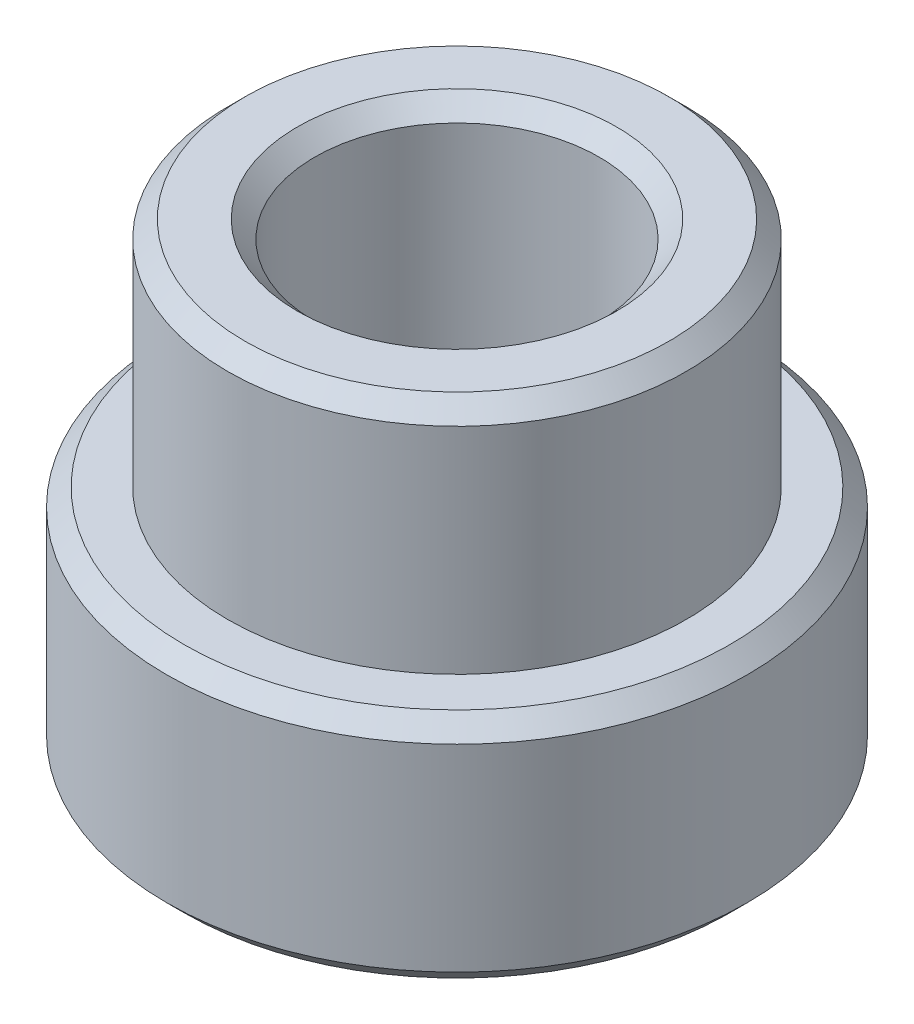
ISO-10303-21;
HEADER;
FILE_DESCRIPTION(('STEP AP214'),'2;1');
FILE_NAME('part.step','',(''),(''),'','','');
FILE_SCHEMA(('AUTOMOTIVE_DESIGN { 1 0 10303 214 1 1 1 1 }'));
ENDSEC;
DATA;
#1=APPLICATION_CONTEXT('core data for automotive mechanical design processes');
#2=APPLICATION_PROTOCOL_DEFINITION('international standard','automotive_design',2000,#1);
#3=PRODUCT_CONTEXT('',#1,'mechanical');
#4=PRODUCT('Part','Part','',(#3));
#5=PRODUCT_RELATED_PRODUCT_CATEGORY('part','',(#4));
#6=PRODUCT_DEFINITION_FORMATION('','',#4);
#7=PRODUCT_DEFINITION_CONTEXT('part definition',#1,'design');
#8=PRODUCT_DEFINITION('design','',#6,#7);
#9=PRODUCT_DEFINITION_SHAPE('','',#8);
#10=(LENGTH_UNIT() NAMED_UNIT(*) SI_UNIT(.MILLI.,.METRE.));
#11=(NAMED_UNIT(*) PLANE_ANGLE_UNIT() SI_UNIT($,.RADIAN.));
#12=(NAMED_UNIT(*) SI_UNIT($,.STERADIAN.) SOLID_ANGLE_UNIT());
#13=UNCERTAINTY_MEASURE_WITH_UNIT(LENGTH_MEASURE(1.E-05),#10,'distance_accuracy_value','');
#14=(GEOMETRIC_REPRESENTATION_CONTEXT(3) GLOBAL_UNCERTAINTY_ASSIGNED_CONTEXT((#13)) GLOBAL_UNIT_ASSIGNED_CONTEXT((#10,
#11,#12)) REPRESENTATION_CONTEXT('',''));
#15=CARTESIAN_POINT('',(0.,0.,0.));
#16=DIRECTION('',(0.,0.,1.));
#17=DIRECTION('',(1.,0.,0.));
#18=AXIS2_PLACEMENT_3D('',#15,#16,#17);
#19=CARTESIAN_POINT('',(0.,8.,0.));
#20=DIRECTION('',(0.,1.,0.));
#21=DIRECTION('',(0.,0.,1.));
#22=AXIS2_PLACEMENT_3D('',#19,#20,#21);
#23=PLANE('',#22);
#24=CARTESIAN_POINT('',(0.,8.,0.));
#25=DIRECTION('',(0.,1.,0.));
#26=DIRECTION('',(0.,0.,1.));
#27=AXIS2_PLACEMENT_3D('',#24,#25,#26);
#28=CIRCLE('',#27,2.75);
#29=CARTESIAN_POINT('',(0.,8.,2.75));
#30=VERTEX_POINT('',#29);
#31=EDGE_CURVE('E41',#30,#30,#28,.F.);
#32=ORIENTED_EDGE('',*,*,#31,.T.);
#33=EDGE_LOOP('',(#32));
#34=FACE_BOUND('',#33,.T.);
#35=CARTESIAN_POINT('',(0.,8.,0.));
#36=DIRECTION('',(0.,1.,0.));
#37=DIRECTION('',(0.,0.,1.));
#38=AXIS2_PLACEMENT_3D('',#35,#36,#37);
#39=CIRCLE('',#38,3.65);
#40=CARTESIAN_POINT('',(0.,8.,3.65));
#41=VERTEX_POINT('',#40);
#42=EDGE_CURVE('E45',#41,#41,#39,.T.);
#43=ORIENTED_EDGE('',*,*,#42,.T.);
#44=EDGE_LOOP('',(#43));
#45=FACE_BOUND('',#44,.T.);
#46=ADVANCED_FACE('F34',(#34,#45),#23,.T.);
#47=CARTESIAN_POINT('',(0.,8.,0.));
#48=DIRECTION('',(0.,-1.,0.));
#49=DIRECTION('',(0.,0.,-1.));
#50=AXIS2_PLACEMENT_3D('',#47,#48,#49);
#51=CYLINDRICAL_SURFACE('',#50,5.);
#52=CARTESIAN_POINT('',(0.,0.300000000000002,0.));
#53=DIRECTION('',(0.,1.,0.));
#54=DIRECTION('',(0.,0.,1.));
#55=AXIS2_PLACEMENT_3D('',#52,#53,#54);
#56=CIRCLE('',#55,5.);
#57=CARTESIAN_POINT('',(0.,0.300000000000002,5.));
#58=VERTEX_POINT('',#57);
#59=EDGE_CURVE('E54',#58,#58,#56,.T.);
#60=ORIENTED_EDGE('',*,*,#59,.T.);
#61=EDGE_LOOP('',(#60));
#62=FACE_BOUND('',#61,.T.);
#63=CARTESIAN_POINT('',(0.,3.7,0.));
#64=DIRECTION('',(0.,1.,0.));
#65=DIRECTION('',(0.,0.,1.));
#66=AXIS2_PLACEMENT_3D('',#63,#64,#65);
#67=CIRCLE('',#66,5.);
#68=CARTESIAN_POINT('',(0.,3.7,5.));
#69=VERTEX_POINT('',#68);
#70=EDGE_CURVE('E57',#69,#69,#67,.F.);
#71=ORIENTED_EDGE('',*,*,#70,.T.);
#72=EDGE_LOOP('',(#71));
#73=FACE_BOUND('',#72,.T.);
#74=ADVANCED_FACE('F94',(#62,#73),#51,.T.);
#75=CARTESIAN_POINT('',(0.,0.,0.));
#76=DIRECTION('',(0.,1.,0.));
#77=DIRECTION('',(0.,0.,1.));
#78=AXIS2_PLACEMENT_3D('',#75,#76,#77);
#79=PLANE('',#78);
#80=CARTESIAN_POINT('',(0.,0.,0.));
#81=DIRECTION('',(0.,1.,0.));
#82=DIRECTION('',(0.,0.,1.));
#83=AXIS2_PLACEMENT_3D('',#80,#81,#82);
#84=CIRCLE('',#83,2.75);
#85=CARTESIAN_POINT('',(0.,0.,2.75));
#86=VERTEX_POINT('',#85);
#87=EDGE_CURVE('E66',#86,#86,#84,.T.);
#88=ORIENTED_EDGE('',*,*,#87,.T.);
#89=EDGE_LOOP('',(#88));
#90=FACE_BOUND('',#89,.T.);
#91=CARTESIAN_POINT('',(0.,0.,0.));
#92=DIRECTION('',(0.,1.,0.));
#93=DIRECTION('',(0.,0.,1.));
#94=AXIS2_PLACEMENT_3D('',#91,#92,#93);
#95=CIRCLE('',#94,4.7);
#96=CARTESIAN_POINT('',(0.,0.,4.7));
#97=VERTEX_POINT('',#96);
#98=EDGE_CURVE('E69',#97,#97,#95,.F.);
#99=ORIENTED_EDGE('',*,*,#98,.T.);
#100=EDGE_LOOP('',(#99));
#101=FACE_BOUND('',#100,.T.);
#102=ADVANCED_FACE('F99',(#90,#101),#79,.F.);
#103=CARTESIAN_POINT('',(0.,8.,0.));
#104=DIRECTION('',(0.,-1.,0.));
#105=DIRECTION('',(0.,0.,-1.));
#106=AXIS2_PLACEMENT_3D('',#103,#104,#105);
#107=CYLINDRICAL_SURFACE('',#106,2.45);
#108=CARTESIAN_POINT('',(0.,0.3,0.));
#109=DIRECTION('',(0.,1.,0.));
#110=DIRECTION('',(0.,0.,1.));
#111=AXIS2_PLACEMENT_3D('',#108,#109,#110);
#112=CIRCLE('',#111,2.45);
#113=CARTESIAN_POINT('',(0.,0.3,2.45));
#114=VERTEX_POINT('',#113);
#115=EDGE_CURVE('E60',#114,#114,#112,.F.);
#116=ORIENTED_EDGE('',*,*,#115,.T.);
#117=EDGE_LOOP('',(#116));
#118=FACE_BOUND('',#117,.T.);
#119=CARTESIAN_POINT('',(0.,7.7,0.));
#120=DIRECTION('',(0.,1.,0.));
#121=DIRECTION('',(0.,0.,1.));
#122=AXIS2_PLACEMENT_3D('',#119,#120,#121);
#123=CIRCLE('',#122,2.45);
#124=CARTESIAN_POINT('',(0.,7.7,2.45));
#125=VERTEX_POINT('',#124);
#126=EDGE_CURVE('E63',#125,#125,#123,.T.);
#127=ORIENTED_EDGE('',*,*,#126,.T.);
#128=EDGE_LOOP('',(#127));
#129=FACE_BOUND('',#128,.T.);
#130=ADVANCED_FACE('F89',(#118,#129),#107,.F.);
#131=CARTESIAN_POINT('',(0.,4.,0.));
#132=DIRECTION('',(0.,1.,0.));
#133=DIRECTION('',(0.,0.,1.));
#134=AXIS2_PLACEMENT_3D('',#131,#132,#133);
#135=PLANE('',#134);
#136=CARTESIAN_POINT('',(0.,4.,0.));
#137=DIRECTION('',(0.,1.,0.));
#138=DIRECTION('',(0.,0.,1.));
#139=AXIS2_PLACEMENT_3D('',#136,#137,#138);
#140=CIRCLE('',#139,4.7);
#141=CARTESIAN_POINT('',(0.,4.,4.7));
#142=VERTEX_POINT('',#141);
#143=EDGE_CURVE('E49',#142,#142,#140,.T.);
#144=ORIENTED_EDGE('',*,*,#143,.T.);
#145=EDGE_LOOP('',(#144));
#146=FACE_BOUND('',#145,.T.);
#147=CARTESIAN_POINT('',(0.,4.,0.));
#148=DIRECTION('',(0.,1.,0.));
#149=DIRECTION('',(0.,0.,1.));
#150=AXIS2_PLACEMENT_3D('',#147,#148,#149);
#151=CIRCLE('',#150,3.95);
#152=CARTESIAN_POINT('',(0.,3.99999999999999,3.95));
#153=VERTEX_POINT('',#152);
#154=EDGE_CURVE('E72',#153,#153,#151,.F.);
#155=ORIENTED_EDGE('',*,*,#154,.T.);
#156=EDGE_LOOP('',(#155));
#157=FACE_BOUND('',#156,.T.);
#158=ADVANCED_FACE('F76',(#146,#157),#135,.T.);
#159=CARTESIAN_POINT('',(0.,-28.2842712474619,0.));
#160=DIRECTION('',(0.,1.,0.));
#161=DIRECTION('',(0.,0.,1.));
#162=AXIS2_PLACEMENT_3D('',#159,#160,#161);
#163=CYLINDRICAL_SURFACE('',#162,3.95);
#164=CARTESIAN_POINT('',(0.,7.7,0.));
#165=DIRECTION('',(0.,1.,0.));
#166=DIRECTION('',(0.,0.,1.));
#167=AXIS2_PLACEMENT_3D('',#164,#165,#166);
#168=CIRCLE('',#167,3.95);
#169=CARTESIAN_POINT('',(0.,7.7,3.95));
#170=VERTEX_POINT('',#169);
#171=EDGE_CURVE('E11',#170,#170,#168,.F.);
#172=CARTESIAN_POINT('',(0.,7.7,3.95));
#173=CARTESIAN_POINT('',(0.,7.66145833333333,3.95));
#174=CARTESIAN_POINT('',(0.,7.62291666666666,3.95));
#175=CARTESIAN_POINT('',(0.,7.54583333333333,3.95));
#176=CARTESIAN_POINT('',(0.,7.50729166666666,3.95));
#177=CARTESIAN_POINT('',(0.,7.43020833333333,3.95));
#178=CARTESIAN_POINT('',(0.,7.39166666666666,3.95));
#179=CARTESIAN_POINT('',(0.,7.31458333333333,3.95));
#180=CARTESIAN_POINT('',(0.,7.27604166666666,3.95));
#181=CARTESIAN_POINT('',(0.,7.19895833333333,3.95));
#182=CARTESIAN_POINT('',(0.,7.16041666666666,3.95));
#183=CARTESIAN_POINT('',(0.,7.08333333333333,3.95));
#184=CARTESIAN_POINT('',(0.,7.04479166666667,3.95));
#185=CARTESIAN_POINT('',(0.,6.96770833333333,3.95));
#186=CARTESIAN_POINT('',(0.,6.92916666666666,3.95));
#187=CARTESIAN_POINT('',(0.,6.85208333333333,3.95));
#188=CARTESIAN_POINT('',(0.,6.81354166666666,3.95));
#189=CARTESIAN_POINT('',(0.,6.73645833333333,3.95));
#190=CARTESIAN_POINT('',(0.,6.69791666666666,3.95));
#191=CARTESIAN_POINT('',(0.,6.62083333333333,3.95));
#192=CARTESIAN_POINT('',(0.,6.58229166666666,3.95));
#193=CARTESIAN_POINT('',(0.,6.50520833333333,3.95));
#194=CARTESIAN_POINT('',(0.,6.46666666666666,3.95));
#195=CARTESIAN_POINT('',(0.,6.38958333333333,3.95));
#196=CARTESIAN_POINT('',(0.,6.35104166666666,3.95));
#197=CARTESIAN_POINT('',(0.,6.27395833333333,3.95));
#198=CARTESIAN_POINT('',(0.,6.23541666666666,3.95));
#199=CARTESIAN_POINT('',(0.,6.15833333333333,3.95));
#200=CARTESIAN_POINT('',(0.,6.11979166666666,3.95));
#201=CARTESIAN_POINT('',(0.,6.04270833333333,3.95));
#202=CARTESIAN_POINT('',(0.,6.00416666666666,3.95));
#203=CARTESIAN_POINT('',(0.,5.92708333333333,3.95));
#204=CARTESIAN_POINT('',(0.,5.88854166666666,3.95));
#205=CARTESIAN_POINT('',(0.,5.81145833333333,3.95));
#206=CARTESIAN_POINT('',(0.,5.77291666666666,3.95));
#207=CARTESIAN_POINT('',(0.,5.69583333333333,3.95));
#208=CARTESIAN_POINT('',(0.,5.65729166666666,3.95));
#209=CARTESIAN_POINT('',(0.,5.58020833333333,3.95));
#210=CARTESIAN_POINT('',(0.,5.54166666666666,3.95));
#211=CARTESIAN_POINT('',(0.,5.46458333333332,3.95));
#212=CARTESIAN_POINT('',(0.,5.42604166666666,3.95));
#213=CARTESIAN_POINT('',(0.,5.34895833333332,3.95));
#214=CARTESIAN_POINT('',(0.,5.31041666666666,3.95));
#215=CARTESIAN_POINT('',(0.,5.23333333333333,3.95));
#216=CARTESIAN_POINT('',(0.,5.19479166666666,3.95));
#217=CARTESIAN_POINT('',(0.,5.11770833333333,3.95));
#218=CARTESIAN_POINT('',(0.,5.07916666666666,3.95));
#219=CARTESIAN_POINT('',(0.,5.00208333333333,3.95));
#220=CARTESIAN_POINT('',(0.,4.96354166666666,3.95));
#221=CARTESIAN_POINT('',(0.,4.88645833333332,3.95));
#222=CARTESIAN_POINT('',(0.,4.84791666666666,3.95));
#223=CARTESIAN_POINT('',(0.,4.77083333333332,3.95));
#224=CARTESIAN_POINT('',(0.,4.73229166666666,3.95));
#225=CARTESIAN_POINT('',(0.,4.65520833333332,3.95));
#226=CARTESIAN_POINT('',(0.,4.61666666666666,3.95));
#227=CARTESIAN_POINT('',(0.,4.53958333333332,3.95));
#228=CARTESIAN_POINT('',(0.,4.50104166666666,3.95));
#229=CARTESIAN_POINT('',(0.,4.42395833333333,3.95));
#230=CARTESIAN_POINT('',(0.,4.38541666666666,3.95));
#231=CARTESIAN_POINT('',(0.,4.30833333333333,3.95));
#232=CARTESIAN_POINT('',(0.,4.26979166666666,3.95));
#233=CARTESIAN_POINT('',(0.,4.19270833333333,3.95));
#234=CARTESIAN_POINT('',(0.,4.15416666666666,3.95));
#235=CARTESIAN_POINT('',(0.,4.07708333333332,3.95));
#236=CARTESIAN_POINT('',(0.,4.03854166666666,3.95));
#237=CARTESIAN_POINT('',(0.,3.99999999999999,3.95));
#238=B_SPLINE_CURVE_WITH_KNOTS('',3,(#172,#173,#174,#175,#176,#177,#178,#179,#180,#181,#182,
#183,#184,#185,#186,#187,#188,#189,#190,#191,#192,#193,#194,#195,#196,#197,#198,#199,#200,#201,
#202,#203,#204,#205,#206,#207,#208,#209,#210,#211,#212,#213,#214,#215,#216,#217,#218,#219,#220,
#221,#222,#223,#224,#225,#226,#227,#228,#229,#230,#231,#232,#233,#234,#235,#236,#237),
.UNSPECIFIED.,.F.,.F.,(4,2,2,2,2,2,2,2,2,2,2,2,2,2,2,2,2,2,2,2,2,2,2,2,2,2,2,2,2,2,2,2,4),(0.,
0.115625000000001,0.231250000000002,0.346875000000003,0.462500000000005,0.578124999999999,
0.69375,0.809375000000001,0.925000000000002,1.040625,1.15625,1.27187500000001,1.3875,1.503125,
1.61875,1.734375,1.85,1.96562500000001,2.08125000000001,2.19687500000001,2.31250000000001,
2.428125,2.54375,2.65937500000001,2.77500000000001,2.89062500000001,3.00625000000001,
3.12187500000001,3.2375,3.35312500000001,3.46875000000001,3.58437500000001,3.70000000000001),.UNSPECIFIED.);
#239=EDGE_CURVE('BSEAM78',#170,#153,#238,.T.);
#240=ORIENTED_EDGE('',*,*,#171,.T.);
#241=ORIENTED_EDGE('',*,*,#154,.F.);
#242=ORIENTED_EDGE('',*,*,#239,.T.);
#243=ORIENTED_EDGE('',*,*,#239,.F.);
#244=EDGE_LOOP('',(#240,#242,#241,#243));
#245=FACE_BOUND('',#244,.T.);
#246=ADVANCED_FACE('F78',(#245),#163,.T.);
#247=CARTESIAN_POINT('',(0.,0.,0.));
#248=DIRECTION('',(0.,-1.,0.));
#249=DIRECTION('',(0.,0.,-1.));
#250=AXIS2_PLACEMENT_3D('',#247,#248,#249);
#251=CONICAL_SURFACE('',#250,2.75,0.785398163397445);
#252=ORIENTED_EDGE('',*,*,#115,.F.);
#253=EDGE_LOOP('',(#252));
#254=FACE_BOUND('',#253,.T.);
#255=ORIENTED_EDGE('',*,*,#87,.F.);
#256=EDGE_LOOP('',(#255));
#257=FACE_BOUND('',#256,.T.);
#258=ADVANCED_FACE('F80',(#254,#257),#251,.F.);
#259=CARTESIAN_POINT('',(0.,0.300000000000002,0.));
#260=DIRECTION('',(0.,1.,0.));
#261=DIRECTION('',(0.,0.,1.));
#262=AXIS2_PLACEMENT_3D('',#259,#260,#261);
#263=CONICAL_SURFACE('',#262,5.,0.78539816339745);
#264=ORIENTED_EDGE('',*,*,#98,.F.);
#265=EDGE_LOOP('',(#264));
#266=FACE_BOUND('',#265,.T.);
#267=ORIENTED_EDGE('',*,*,#59,.F.);
#268=EDGE_LOOP('',(#267));
#269=FACE_BOUND('',#268,.T.);
#270=ADVANCED_FACE('F86',(#266,#269),#263,.T.);
#271=CARTESIAN_POINT('',(0.,4.,0.));
#272=DIRECTION('',(0.,-1.,0.));
#273=DIRECTION('',(0.,0.,-1.));
#274=AXIS2_PLACEMENT_3D('',#271,#272,#273);
#275=CONICAL_SURFACE('',#274,4.7,0.785398163397445);
#276=ORIENTED_EDGE('',*,*,#70,.F.);
#277=EDGE_LOOP('',(#276));
#278=FACE_BOUND('',#277,.T.);
#279=ORIENTED_EDGE('',*,*,#143,.F.);
#280=EDGE_LOOP('',(#279));
#281=FACE_BOUND('',#280,.T.);
#282=ADVANCED_FACE('F109',(#278,#281),#275,.T.);
#283=CARTESIAN_POINT('',(0.,7.7,0.));
#284=DIRECTION('',(0.,1.,0.));
#285=DIRECTION('',(0.,0.,1.));
#286=AXIS2_PLACEMENT_3D('',#283,#284,#285);
#287=CONICAL_SURFACE('',#286,2.45,0.785398163397453);
#288=ORIENTED_EDGE('',*,*,#31,.F.);
#289=EDGE_LOOP('',(#288));
#290=FACE_BOUND('',#289,.T.);
#291=ORIENTED_EDGE('',*,*,#126,.F.);
#292=EDGE_LOOP('',(#291));
#293=FACE_BOUND('',#292,.T.);
#294=ADVANCED_FACE('F112',(#290,#293),#287,.F.);
#295=CARTESIAN_POINT('',(0.,8.,0.));
#296=DIRECTION('',(0.,-1.,0.));
#297=DIRECTION('',(0.,0.,-1.));
#298=AXIS2_PLACEMENT_3D('',#295,#296,#297);
#299=CONICAL_SURFACE('',#298,3.65,0.78539816339745);
#300=ORIENTED_EDGE('',*,*,#171,.F.);
#301=EDGE_LOOP('',(#300));
#302=FACE_BOUND('',#301,.T.);
#303=ORIENTED_EDGE('',*,*,#42,.F.);
#304=EDGE_LOOP('',(#303));
#305=FACE_BOUND('',#304,.T.);
#306=ADVANCED_FACE('F36',(#302,#305),#299,.T.);
#307=CLOSED_SHELL('',(#46,#74,#102,#130,#158,#246,#258,#270,#282,#294,#306));
#308=MANIFOLD_SOLID_BREP('B2',#307);
#309=ADVANCED_BREP_SHAPE_REPRESENTATION('',(#18,#308),#14);
#310=SHAPE_DEFINITION_REPRESENTATION(#9,#309);
ENDSEC;
END-ISO-10303-21;
